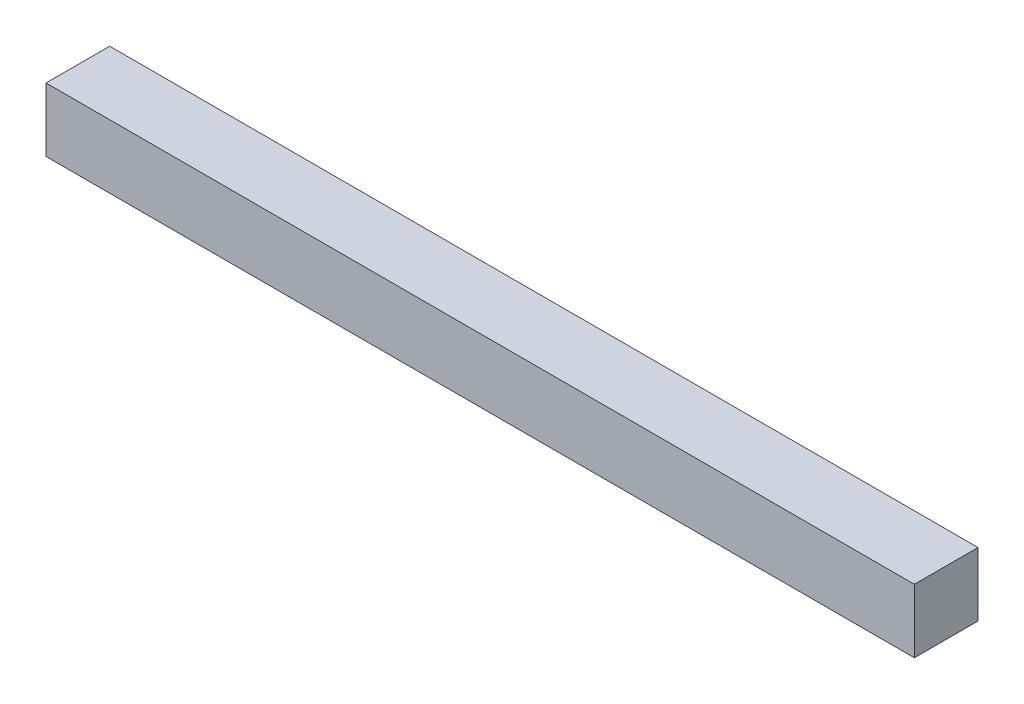
ISO-10303-21;
HEADER;
FILE_DESCRIPTION(('STEP AP214'),'2;1');
FILE_NAME('part.step','',(''),(''),'','','');
FILE_SCHEMA(('AUTOMOTIVE_DESIGN { 1 0 10303 214 1 1 1 1 }'));
ENDSEC;
DATA;
#1=APPLICATION_CONTEXT('core data for automotive mechanical design processes');
#2=APPLICATION_PROTOCOL_DEFINITION('international standard','automotive_design',2000,#1);
#3=PRODUCT_CONTEXT('',#1,'mechanical');
#4=PRODUCT('Part','Part','',(#3));
#5=PRODUCT_RELATED_PRODUCT_CATEGORY('part','',(#4));
#6=PRODUCT_DEFINITION_FORMATION('','',#4);
#7=PRODUCT_DEFINITION_CONTEXT('part definition',#1,'design');
#8=PRODUCT_DEFINITION('design','',#6,#7);
#9=PRODUCT_DEFINITION_SHAPE('','',#8);
#10=(LENGTH_UNIT() NAMED_UNIT(*) SI_UNIT(.MILLI.,.METRE.));
#11=(NAMED_UNIT(*) PLANE_ANGLE_UNIT() SI_UNIT($,.RADIAN.));
#12=(NAMED_UNIT(*) SI_UNIT($,.STERADIAN.) SOLID_ANGLE_UNIT());
#13=UNCERTAINTY_MEASURE_WITH_UNIT(LENGTH_MEASURE(1.E-05),#10,'distance_accuracy_value','');
#14=(GEOMETRIC_REPRESENTATION_CONTEXT(3) GLOBAL_UNCERTAINTY_ASSIGNED_CONTEXT((#13)) GLOBAL_UNIT_ASSIGNED_CONTEXT((#10,
#11,#12)) REPRESENTATION_CONTEXT('',''));
#15=CARTESIAN_POINT('',(0.,0.,0.));
#16=DIRECTION('',(0.,0.,1.));
#17=DIRECTION('',(1.,0.,0.));
#18=AXIS2_PLACEMENT_3D('',#15,#16,#17);
#19=CARTESIAN_POINT('',(0.,11.,0.));
#20=DIRECTION('',(0.,1.,0.));
#21=DIRECTION('',(1.,0.,0.));
#22=AXIS2_PLACEMENT_3D('',#19,#20,#21);
#23=PLANE('',#22);
#24=DIRECTION('',(0.,0.,-1.));
#25=VECTOR('',#24,1.);
#26=CARTESIAN_POINT('',(0.,11.,22.));
#27=LINE('',#26,#25);
#28=CARTESIAN_POINT('',(0.,11.,22.));
#29=VERTEX_POINT('',#28);
#30=CARTESIAN_POINT('',(0.,11.,0.));
#31=VERTEX_POINT('',#30);
#32=EDGE_CURVE('E39',#29,#31,#27,.T.);
#33=ORIENTED_EDGE('',*,*,#32,.F.);
#34=DIRECTION('',(1.,0.,0.));
#35=VECTOR('',#34,1.);
#36=CARTESIAN_POINT('',(0.,11.,22.));
#37=LINE('',#36,#35);
#38=CARTESIAN_POINT('',(300.,11.,22.));
#39=VERTEX_POINT('',#38);
#40=EDGE_CURVE('E11',#29,#39,#37,.T.);
#41=ORIENTED_EDGE('',*,*,#40,.T.);
#42=DIRECTION('',(0.,0.,1.));
#43=VECTOR('',#42,1.);
#44=CARTESIAN_POINT('',(300.,11.,22.));
#45=LINE('',#44,#43);
#46=CARTESIAN_POINT('',(300.,11.,0.));
#47=VERTEX_POINT('',#46);
#48=EDGE_CURVE('E20',#47,#39,#45,.T.);
#49=ORIENTED_EDGE('',*,*,#48,.F.);
#50=DIRECTION('',(1.,0.,0.));
#51=VECTOR('',#50,1.);
#52=CARTESIAN_POINT('',(0.,11.,0.));
#53=LINE('',#52,#51);
#54=EDGE_CURVE('E27',#31,#47,#53,.T.);
#55=ORIENTED_EDGE('',*,*,#54,.F.);
#56=EDGE_LOOP('',(#33,#41,#49,#55));
#57=FACE_BOUND('',#56,.T.);
#58=ADVANCED_FACE('F16',(#57),#23,.T.);
#59=CARTESIAN_POINT('',(0.,-11.,0.));
#60=DIRECTION('',(0.,0.,-1.));
#61=DIRECTION('',(0.,-1.,0.));
#62=AXIS2_PLACEMENT_3D('',#59,#60,#61);
#63=PLANE('',#62);
#64=DIRECTION('',(0.,-1.,0.));
#65=VECTOR('',#64,1.);
#66=CARTESIAN_POINT('',(0.,11.,0.));
#67=LINE('',#66,#65);
#68=CARTESIAN_POINT('',(0.,-11.,0.));
#69=VERTEX_POINT('',#68);
#70=EDGE_CURVE('E74',#31,#69,#67,.T.);
#71=ORIENTED_EDGE('',*,*,#70,.F.);
#72=ORIENTED_EDGE('',*,*,#54,.T.);
#73=DIRECTION('',(0.,1.,0.));
#74=VECTOR('',#73,1.);
#75=CARTESIAN_POINT('',(300.,11.,0.));
#76=LINE('',#75,#74);
#77=CARTESIAN_POINT('',(300.,-11.,0.));
#78=VERTEX_POINT('',#77);
#79=EDGE_CURVE('E86',#78,#47,#76,.T.);
#80=ORIENTED_EDGE('',*,*,#79,.F.);
#81=DIRECTION('',(1.,0.,0.));
#82=VECTOR('',#81,1.);
#83=CARTESIAN_POINT('',(0.,-11.,0.));
#84=LINE('',#83,#82);
#85=EDGE_CURVE('E83',#69,#78,#84,.T.);
#86=ORIENTED_EDGE('',*,*,#85,.F.);
#87=EDGE_LOOP('',(#71,#72,#80,#86));
#88=FACE_BOUND('',#87,.T.);
#89=ADVANCED_FACE('F84',(#88),#63,.T.);
#90=CARTESIAN_POINT('',(0.,-11.,22.));
#91=DIRECTION('',(0.,-1.,0.));
#92=DIRECTION('',(0.,0.,-1.));
#93=AXIS2_PLACEMENT_3D('',#90,#91,#92);
#94=PLANE('',#93);
#95=DIRECTION('',(0.,0.,1.));
#96=VECTOR('',#95,1.);
#97=CARTESIAN_POINT('',(0.,-11.,0.));
#98=LINE('',#97,#96);
#99=CARTESIAN_POINT('',(0.,-11.,22.));
#100=VERTEX_POINT('',#99);
#101=EDGE_CURVE('E78',#69,#100,#98,.T.);
#102=ORIENTED_EDGE('',*,*,#101,.F.);
#103=ORIENTED_EDGE('',*,*,#85,.T.);
#104=DIRECTION('',(0.,0.,-1.));
#105=VECTOR('',#104,1.);
#106=CARTESIAN_POINT('',(300.,-11.,0.));
#107=LINE('',#106,#105);
#108=CARTESIAN_POINT('',(300.,-11.,22.));
#109=VERTEX_POINT('',#108);
#110=EDGE_CURVE('E67',#109,#78,#107,.T.);
#111=ORIENTED_EDGE('',*,*,#110,.F.);
#112=DIRECTION('',(1.,0.,0.));
#113=VECTOR('',#112,1.);
#114=CARTESIAN_POINT('',(0.,-11.,22.));
#115=LINE('',#114,#113);
#116=EDGE_CURVE('E88',#100,#109,#115,.T.);
#117=ORIENTED_EDGE('',*,*,#116,.F.);
#118=EDGE_LOOP('',(#102,#103,#111,#117));
#119=FACE_BOUND('',#118,.T.);
#120=ADVANCED_FACE('F90',(#119),#94,.T.);
#121=CARTESIAN_POINT('',(0.,11.,22.));
#122=DIRECTION('',(0.,0.,1.));
#123=DIRECTION('',(1.,0.,0.));
#124=AXIS2_PLACEMENT_3D('',#121,#122,#123);
#125=PLANE('',#124);
#126=DIRECTION('',(0.,1.,0.));
#127=VECTOR('',#126,1.);
#128=CARTESIAN_POINT('',(0.,-11.,22.));
#129=LINE('',#128,#127);
#130=EDGE_CURVE('E101',#100,#29,#129,.T.);
#131=ORIENTED_EDGE('',*,*,#130,.F.);
#132=ORIENTED_EDGE('',*,*,#116,.T.);
#133=DIRECTION('',(0.,-1.,0.));
#134=VECTOR('',#133,1.);
#135=CARTESIAN_POINT('',(300.,-11.,22.));
#136=LINE('',#135,#134);
#137=EDGE_CURVE('E104',#39,#109,#136,.T.);
#138=ORIENTED_EDGE('',*,*,#137,.F.);
#139=ORIENTED_EDGE('',*,*,#40,.F.);
#140=EDGE_LOOP('',(#131,#132,#138,#139));
#141=FACE_BOUND('',#140,.T.);
#142=ADVANCED_FACE('F114',(#141),#125,.T.);
#143=CARTESIAN_POINT('',(300.,0.,11.));
#144=DIRECTION('',(1.,0.,0.));
#145=DIRECTION('',(0.,1.,0.));
#146=AXIS2_PLACEMENT_3D('',#143,#144,#145);
#147=PLANE('',#146);
#148=ORIENTED_EDGE('',*,*,#137,.T.);
#149=ORIENTED_EDGE('',*,*,#110,.T.);
#150=ORIENTED_EDGE('',*,*,#79,.T.);
#151=ORIENTED_EDGE('',*,*,#48,.T.);
#152=EDGE_LOOP('',(#148,#149,#150,#151));
#153=FACE_BOUND('',#152,.T.);
#154=ADVANCED_FACE('F112',(#153),#147,.T.);
#155=CARTESIAN_POINT('',(0.,0.,11.));
#156=DIRECTION('',(1.,0.,0.));
#157=DIRECTION('',(0.,1.,0.));
#158=AXIS2_PLACEMENT_3D('',#155,#156,#157);
#159=PLANE('',#158);
#160=ORIENTED_EDGE('',*,*,#130,.T.);
#161=ORIENTED_EDGE('',*,*,#32,.T.);
#162=ORIENTED_EDGE('',*,*,#70,.T.);
#163=ORIENTED_EDGE('',*,*,#101,.T.);
#164=EDGE_LOOP('',(#160,#161,#162,#163));
#165=FACE_BOUND('',#164,.T.);
#166=ADVANCED_FACE('F18',(#165),#159,.F.);
#167=CLOSED_SHELL('',(#58,#89,#120,#142,#154,#166));
#168=MANIFOLD_SOLID_BREP('B1',#167);
#169=ADVANCED_BREP_SHAPE_REPRESENTATION('',(#18,#168),#14);
#170=SHAPE_DEFINITION_REPRESENTATION(#9,#169);
ENDSEC;
END-ISO-10303-21;
